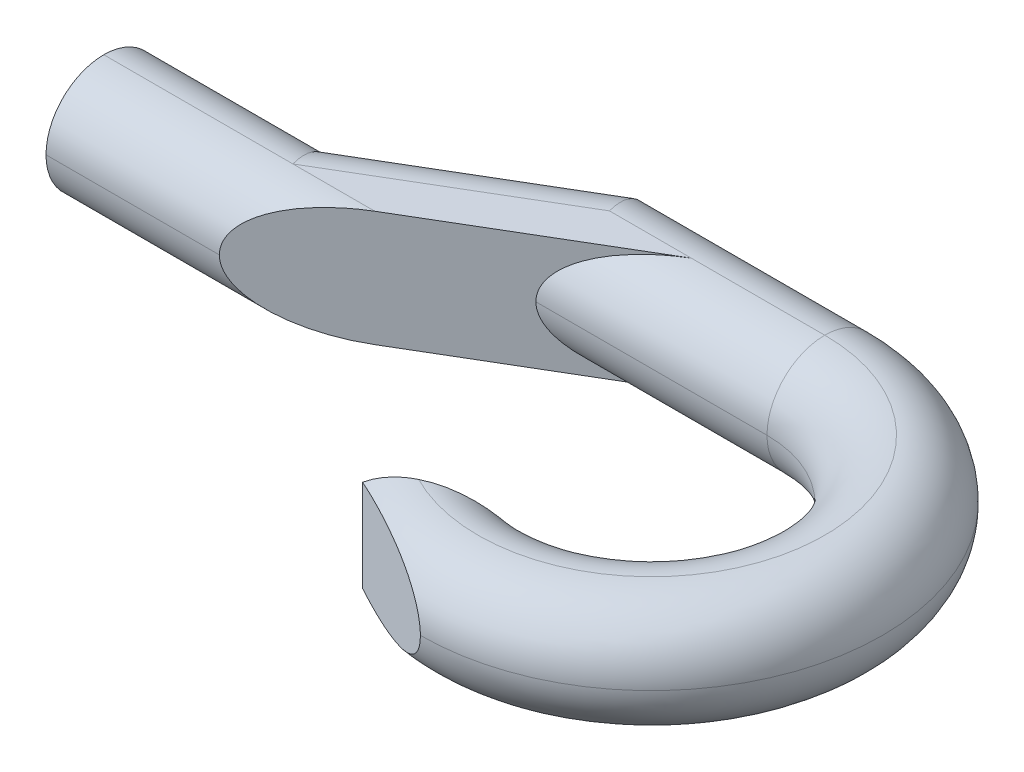
ISO-10303-21;
HEADER;
FILE_DESCRIPTION(('STEP AP214'),'2;1');
FILE_NAME('part.step','',(''),(''),'','','');
FILE_SCHEMA(('AUTOMOTIVE_DESIGN { 1 0 10303 214 1 1 1 1 }'));
ENDSEC;
DATA;
#1=APPLICATION_CONTEXT('core data for automotive mechanical design processes');
#2=APPLICATION_PROTOCOL_DEFINITION('international standard','automotive_design',2000,#1);
#3=PRODUCT_CONTEXT('',#1,'mechanical');
#4=PRODUCT('Part','Part','',(#3));
#5=PRODUCT_RELATED_PRODUCT_CATEGORY('part','',(#4));
#6=PRODUCT_DEFINITION_FORMATION('','',#4);
#7=PRODUCT_DEFINITION_CONTEXT('part definition',#1,'design');
#8=PRODUCT_DEFINITION('design','',#6,#7);
#9=PRODUCT_DEFINITION_SHAPE('','',#8);
#10=(LENGTH_UNIT() NAMED_UNIT(*) SI_UNIT(.MILLI.,.METRE.));
#11=(NAMED_UNIT(*) PLANE_ANGLE_UNIT() SI_UNIT($,.RADIAN.));
#12=(NAMED_UNIT(*) SI_UNIT($,.STERADIAN.) SOLID_ANGLE_UNIT());
#13=UNCERTAINTY_MEASURE_WITH_UNIT(LENGTH_MEASURE(1.E-05),#10,'distance_accuracy_value','');
#14=(GEOMETRIC_REPRESENTATION_CONTEXT(3) GLOBAL_UNCERTAINTY_ASSIGNED_CONTEXT((#13)) GLOBAL_UNIT_ASSIGNED_CONTEXT((#10,
#11,#12)) REPRESENTATION_CONTEXT('',''));
#15=CARTESIAN_POINT('',(0.,0.,0.));
#16=DIRECTION('',(0.,0.,1.));
#17=DIRECTION('',(1.,0.,0.));
#18=AXIS2_PLACEMENT_3D('',#15,#16,#17);
#19=CARTESIAN_POINT('',(0.,10.,0.));
#20=DIRECTION('',(-0.509011926202966,0.,-0.860759466391829));
#21=DIRECTION('',(-0.860759466391829,0.,0.509011926202966));
#22=AXIS2_PLACEMENT_3D('',#19,#20,#21);
#23=PLANE('',#22);
#24=DIRECTION('',(0.860759466391829,0.,-0.509011926202966));
#25=VECTOR('',#24,1.);
#26=CARTESIAN_POINT('',(0.,10.,0.));
#27=LINE('',#26,#25);
#28=CARTESIAN_POINT('',(-8.75998992992891,10.,5.18023852405933));
#29=VERTEX_POINT('',#28);
#30=CARTESIAN_POINT('',(8.45519939790767,10.,-5.));
#31=VERTEX_POINT('',#30);
#32=EDGE_CURVE('E330',#29,#31,#27,.T.);
#33=ORIENTED_EDGE('',*,*,#32,.F.);
#34=CARTESIAN_POINT('',(-8.75998992992891,5.,5.18023852405933));
#35=DIRECTION('',(-0.509011926202966,0.,-0.860759466391829));
#36=DIRECTION('',(0.860759466391829,0.,-0.509011926202966));
#37=AXIS2_PLACEMENT_3D('',#34,#35,#36);
#38=ELLIPSE('',#37,9.82295255299435,5.);
#39=CARTESIAN_POINT('',(-17.2151893278366,5.,10.1802385240593));
#40=VERTEX_POINT('',#39);
#41=EDGE_CURVE('E276',#29,#40,#38,.F.);
#42=ORIENTED_EDGE('',*,*,#41,.T.);
#43=CARTESIAN_POINT('',(-8.75998992992891,5.,5.18023852405933));
#44=DIRECTION('',(-0.509011926202966,0.,-0.860759466391829));
#45=DIRECTION('',(-0.860759466391829,0.,0.509011926202966));
#46=AXIS2_PLACEMENT_3D('',#43,#44,#45);
#47=ELLIPSE('',#46,9.82295255299435,5.);
#48=CARTESIAN_POINT('',(-8.75998992992891,0.,5.18023852405933));
#49=VERTEX_POINT('',#48);
#50=EDGE_CURVE('E279',#40,#49,#47,.F.);
#51=ORIENTED_EDGE('',*,*,#50,.T.);
#52=DIRECTION('',(0.860759466391829,0.,-0.509011926202966));
#53=VECTOR('',#52,1.);
#54=CARTESIAN_POINT('',(0.,0.,0.));
#55=LINE('',#54,#53);
#56=CARTESIAN_POINT('',(8.45519939790767,0.,-5.));
#57=VERTEX_POINT('',#56);
#58=EDGE_CURVE('E127',#49,#57,#55,.T.);
#59=ORIENTED_EDGE('',*,*,#58,.T.);
#60=CARTESIAN_POINT('',(8.45519939790767,5.,-5.));
#61=DIRECTION('',(-0.509011926202966,0.,-0.860759466391829));
#62=DIRECTION('',(-0.860759466391829,0.,0.509011926202966));
#63=AXIS2_PLACEMENT_3D('',#60,#61,#62);
#64=ELLIPSE('',#63,9.82295255299435,5.);
#65=CARTESIAN_POINT('',(0.,5.,0.));
#66=VERTEX_POINT('',#65);
#67=EDGE_CURVE('E255',#57,#66,#64,.T.);
#68=ORIENTED_EDGE('',*,*,#67,.T.);
#69=CARTESIAN_POINT('',(8.45519939790767,5.,-5.));
#70=DIRECTION('',(-0.509011926202966,0.,-0.860759466391829));
#71=DIRECTION('',(0.860759466391829,0.,-0.509011926202966));
#72=AXIS2_PLACEMENT_3D('',#69,#70,#71);
#73=ELLIPSE('',#72,9.82295255299435,5.);
#74=EDGE_CURVE('E270',#66,#31,#73,.T.);
#75=ORIENTED_EDGE('',*,*,#74,.T.);
#76=EDGE_LOOP('',(#33,#42,#51,#59,#68,#75));
#77=FACE_BOUND('',#76,.T.);
#78=ADVANCED_FACE('F34',(#77),#23,.F.);
#79=CARTESIAN_POINT('',(10.,10.,25.));
#80=DIRECTION('',(0.447213595499959,0.,0.894427190999916));
#81=DIRECTION('',(0.894427190999916,0.,-0.447213595499959));
#82=AXIS2_PLACEMENT_3D('',#79,#80,#81);
#83=PLANE('',#82);
#84=DIRECTION('',(0.,-1.,0.));
#85=VECTOR('',#84,1.);
#86=CARTESIAN_POINT('',(10.,10.,25.));
#87=LINE('',#86,#85);
#88=CARTESIAN_POINT('',(10.,8.97903145496468,25.));
#89=VERTEX_POINT('',#88);
#90=CARTESIAN_POINT('',(10.,1.02096854503532,25.));
#91=VERTEX_POINT('',#90);
#92=EDGE_CURVE('E189',#89,#91,#87,.T.);
#93=ORIENTED_EDGE('',*,*,#92,.F.);
#94=CARTESIAN_POINT('',(10.,8.97903145496468,25.));
#95=CARTESIAN_POINT('',(10.1314438396655,9.07614599086489,24.9342780801672));
#96=CARTESIAN_POINT('',(10.2669743519538,9.16620637315305,24.8665128240231));
#97=CARTESIAN_POINT('',(10.5446756551384,9.33213816624486,24.7276621724308));
#98=CARTESIAN_POINT('',(10.6868406381703,9.40802170680212,24.6565796809148));
#99=CARTESIAN_POINT('',(10.9732750556043,9.54414936479432,24.5133624721979));
#100=CARTESIAN_POINT('',(11.1174266422655,9.60470482611481,24.4412866788673));
#101=CARTESIAN_POINT('',(11.4096210452549,9.71253640143507,24.2951894773726));
#102=CARTESIAN_POINT('',(11.557664153243,9.75981151698451,24.2211679233785));
#103=CARTESIAN_POINT('',(11.9535861152284,9.86783688979917,24.0232069423858));
#104=CARTESIAN_POINT('',(12.2039710077293,9.91745575796615,23.8980144961353));
#105=CARTESIAN_POINT('',(12.5843441188074,9.96710390878704,23.7078279405963));
#106=CARTESIAN_POINT('',(12.7131902022344,9.97951874402064,23.6434048988828));
#107=CARTESIAN_POINT('',(12.9712381026715,9.99596154178999,23.5143809486643));
#108=CARTESIAN_POINT('',(13.1004396713526,9.9999943423065,23.4497801643237));
#109=CARTESIAN_POINT('',(13.229670385731,10.,23.3851648071345));
#110=B_SPLINE_CURVE_WITH_KNOTS('',3,(#94,#95,#96,#97,#98,#99,#100,#101,#102,#103,#104,#105,#106,
#107,#108,#109),.UNSPECIFIED.,.F.,.F.,(4,2,2,2,2,2,2,4),(0.,0.528131920993864,1.05580988009316,
1.57170680215591,2.0876425002934,2.9380369621023,3.37160826661759,3.80492925091076),.UNSPECIFIED.);
#111=CARTESIAN_POINT('',(13.229670385731,10.,23.3851648071345));
#112=VERTEX_POINT('',#111);
#113=EDGE_CURVE('E136',#89,#112,#110,.T.);
#114=ORIENTED_EDGE('',*,*,#113,.T.);
#115=CARTESIAN_POINT('',(13.229670385731,10.,23.3851648071345));
#116=CARTESIAN_POINT('',(13.4192563852724,9.9999874132156,23.2903718073638));
#117=CARTESIAN_POINT('',(13.6086996385396,9.99131417253069,23.1956501807302));
#118=CARTESIAN_POINT('',(13.9862774951186,9.95761326675993,23.0068612524407));
#119=CARTESIAN_POINT('',(14.1744130183487,9.93259859713784,22.9127934908257));
#120=CARTESIAN_POINT('',(14.7348645587275,9.83462832780576,22.6325677206363));
#121=CARTESIAN_POINT('',(15.1041585449585,9.73873687115786,22.4479207275208));
#122=CARTESIAN_POINT('',(15.6717311142593,9.54601317846157,22.1641344428704));
#123=CARTESIAN_POINT('',(15.8752201519589,9.4673406705736,22.0623899240206));
#124=CARTESIAN_POINT('',(16.2765097615109,9.29357585474262,21.8617451192445));
#125=CARTESIAN_POINT('',(16.4743117134408,9.19848757030224,21.7628441432796));
#126=CARTESIAN_POINT('',(16.8635463993545,8.99259816803629,21.5682268003227));
#127=CARTESIAN_POINT('',(17.0549705758971,8.88177691194088,21.4725147120514));
#128=CARTESIAN_POINT('',(17.4301511212549,8.64501474345501,21.2849244393726));
#129=CARTESIAN_POINT('',(17.6139096575384,8.51907814453133,21.1930451712308));
#130=CARTESIAN_POINT('',(17.9132516797742,8.29611467801229,21.0433741601129));
#131=CARTESIAN_POINT('',(18.0313303551182,8.20325318441014,20.9843348224409));
#132=CARTESIAN_POINT('',(18.2628310257111,8.01055365311796,20.8685844871444));
#133=CARTESIAN_POINT('',(18.3762538271889,7.91071683146165,20.8118730864055));
#134=CARTESIAN_POINT('',(18.5975290154277,7.70381163099563,20.7012354922861));
#135=CARTESIAN_POINT('',(18.7053868068974,7.59675051089487,20.6473065965513));
#136=CARTESIAN_POINT('',(18.9143927129238,7.37478224912413,20.5428036435381));
#137=CARTESIAN_POINT('',(19.0155433425784,7.25987808167234,20.4922283287108));
#138=CARTESIAN_POINT('',(19.2347191638469,6.99024872681707,20.3826404180765));
#139=CARTESIAN_POINT('',(19.3502593331098,6.83295696726374,20.3248703334451));
#140=CARTESIAN_POINT('',(19.5619217470014,6.50258237434365,20.2190391264993));
#141=CARTESIAN_POINT('',(19.6580709782211,6.32952198053633,20.1709645108894));
#142=CARTESIAN_POINT('',(19.7975682401305,6.01872983814376,20.1012158799347));
#143=CARTESIAN_POINT('',(19.8481503462006,5.88511767425433,20.0759248268997));
#144=CARTESIAN_POINT('',(19.9293116483345,5.61065935717491,20.0353441758327));
#145=CARTESIAN_POINT('',(19.9599632530537,5.4698414181651,20.0200183734731));
#146=CARTESIAN_POINT('',(19.9856864990253,5.27307515954598,20.0071567504874));
#147=CARTESIAN_POINT('',(19.9910339577537,5.21868524118308,20.0044830211231));
#148=CARTESIAN_POINT('',(19.9981957887106,5.10953951098989,20.0009021056447));
#149=CARTESIAN_POINT('',(20.0000051899633,5.05478329266055,19.9999974050183));
#150=CARTESIAN_POINT('',(20.,5.,20.));
#151=B_SPLINE_CURVE_WITH_KNOTS('',3,(#115,#116,#117,#118,#119,#120,#121,#122,#123,#124,#125,
#126,#127,#128,#129,#130,#131,#132,#133,#134,#135,#136,#137,#138,#139,#140,#141,#142,#143,#144,
#145,#146,#147,#148,#149,#150),.UNSPECIFIED.,.F.,.F.,(4,2,2,2,2,2,2,2,2,2,2,2,2,2,2,2,2,4),(0.,
0.635437473470802,1.27037023167414,2.53713701981072,3.25881661146123,3.98031957010776,
4.70275452475914,5.42498380607441,5.90899618345029,6.39292439076517,6.87637340380685,
7.3596400924358,7.96902325642079,8.57755239180175,9.01139474726357,9.44365198904135,
9.60768283097407,9.77194397134858),.UNSPECIFIED.);
#152=CARTESIAN_POINT('',(20.,5.,20.));
#153=VERTEX_POINT('',#152);
#154=EDGE_CURVE('E118',#112,#153,#151,.T.);
#155=ORIENTED_EDGE('',*,*,#154,.T.);
#156=CARTESIAN_POINT('',(20.,5.,20.));
#157=CARTESIAN_POINT('',(20.0000439205309,4.92725282215048,19.9999780397345));
#158=CARTESIAN_POINT('',(19.9968261885751,4.85453530196578,20.0015869057125));
#159=CARTESIAN_POINT('',(19.9842112124369,4.70990085737239,20.0078943937816));
#160=CARTESIAN_POINT('',(19.9748251216294,4.63798272577121,20.0125874391853));
#161=CARTESIAN_POINT('',(19.9504045673756,4.49651991326119,20.0247977163122));
#162=CARTESIAN_POINT('',(19.9354593654064,4.4269557359731,20.0322703172968));
#163=CARTESIAN_POINT('',(19.9004341573766,4.28944317042663,20.0497829213117));
#164=CARTESIAN_POINT('',(19.8803515454654,4.22149562134528,20.0598242272673));
#165=CARTESIAN_POINT('',(19.8275381122595,4.06325621405904,20.0862309438702));
#166=CARTESIAN_POINT('',(19.7928600479341,3.97377561311698,20.1035699760329));
#167=CARTESIAN_POINT('',(19.7165085134984,3.79865472928668,20.1417457432508));
#168=CARTESIAN_POINT('',(19.6748323358537,3.713015949092,20.1625838320731));
#169=CARTESIAN_POINT('',(19.5406306226454,3.46066118026153,20.2296846886773));
#170=CARTESIAN_POINT('',(19.43937564948,3.29973280386885,20.28031217526));
#171=CARTESIAN_POINT('',(19.2295408933711,3.00355830545036,20.3852295533145));
#172=CARTESIAN_POINT('',(19.1220732376573,2.86729171734751,20.4389633811714));
#173=CARTESIAN_POINT('',(18.8972127602712,2.60525156607407,20.5513936198644));
#174=CARTESIAN_POINT('',(18.7798117034918,2.47948688436479,20.6100941482541));
#175=CARTESIAN_POINT('',(18.5372550105338,2.23747257553187,20.7313724947331));
#176=CARTESIAN_POINT('',(18.4120915565041,2.12123282404359,20.7939542217479));
#177=CARTESIAN_POINT('',(18.1554797240984,1.89774332979946,20.9222601379508));
#178=CARTESIAN_POINT('',(18.0240296104887,1.79049609189585,20.9879851947556));
#179=CARTESIAN_POINT('',(17.6844968691111,1.52995260930174,21.1577515654444));
#180=CARTESIAN_POINT('',(17.4728194846964,1.38247975475447,21.2635902576518));
#181=CARTESIAN_POINT('',(17.0391511045579,1.10770638384676,21.4804244477211));
#182=CARTESIAN_POINT('',(16.8171548830728,0.980416235755965,21.5914225584636));
#183=CARTESIAN_POINT('',(16.3650570183997,0.747178337491017,21.8174714908001));
#184=CARTESIAN_POINT('',(16.1349786997275,0.641174287225436,21.9325106501362));
#185=CARTESIAN_POINT('',(15.6675910820753,0.451469522334892,22.1662044589623));
#186=CARTESIAN_POINT('',(15.4302812971111,0.367770310386471,22.2848593514444));
#187=CARTESIAN_POINT('',(14.870831347886,0.200916672026909,22.564584326057));
#188=CARTESIAN_POINT('',(14.546408340746,0.126954071020458,22.726795829627));
#189=CARTESIAN_POINT('',(14.0553360034705,0.0516125931084803,22.9723319982648));
#190=CARTESIAN_POINT('',(13.890755820862,0.0324313229934739,23.054622089569));
#191=CARTESIAN_POINT('',(13.560703175855,0.00662411355169991,23.2196484120725));
#192=CARTESIAN_POINT('',(13.3952301821002,6.73404712988565E-06,23.3023849089499));
#193=CARTESIAN_POINT('',(13.229670385731,0.,23.3851648071345));
#194=B_SPLINE_CURVE_WITH_KNOTS('',3,(#156,#157,#158,#159,#160,#161,#162,#163,#164,#165,#166,
#167,#168,#169,#170,#171,#172,#173,#174,#175,#176,#177,#178,#179,#180,#181,#182,#183,#184,#185,
#186,#187,#188,#189,#190,#191,#192,#193),.UNSPECIFIED.,.F.,.F.,(4,2,2,2,2,2,2,2,2,2,2,2,2,2,2,2,
2,2,4),(0.,0.218105244773615,0.435817201607098,0.650174541403505,0.864640826104793,
1.15671017290262,1.44889278130492,2.03717949471163,2.58152244632342,3.12632118232809,
3.67167781150728,4.21718584784023,5.05264684738999,5.88853565942876,6.72218361322469,
7.55588771567754,8.66317362461275,9.21781343072216,9.77283097944401),.UNSPECIFIED.);
#195=CARTESIAN_POINT('',(13.229670385731,0.,23.3851648071345));
#196=VERTEX_POINT('',#195);
#197=EDGE_CURVE('E195',#153,#196,#194,.T.);
#198=ORIENTED_EDGE('',*,*,#197,.T.);
#199=CARTESIAN_POINT('',(13.229670385731,0.,23.3851648071345));
#200=CARTESIAN_POINT('',(13.0367481688262,-1.80123719044556E-05,23.4816259155869));
#201=CARTESIAN_POINT('',(12.8437293967664,0.00899637278797433,23.5781353016168));
#202=CARTESIAN_POINT('',(12.4588019108266,0.0460544146975102,23.7705990445867));
#203=CARTESIAN_POINT('',(12.2668960182035,0.074134352529127,23.8665519908982));
#204=CARTESIAN_POINT('',(11.8917541756371,0.149193242742677,24.0541229121814));
#205=CARTESIAN_POINT('',(11.708428038556,0.195601779702971,24.145785980722));
#206=CARTESIAN_POINT('',(11.3467927063992,0.307890148633818,24.3266036468004));
#207=CARTESIAN_POINT('',(11.1684783224901,0.373748963674398,24.4157608387549));
#208=CARTESIAN_POINT('',(10.8209132909679,0.524481870568148,24.5895433545161));
#209=CARTESIAN_POINT('',(10.6515771859414,0.609107880819837,24.6742114070293));
#210=CARTESIAN_POINT('',(10.3194755027803,0.799260620275825,24.8402622486099));
#211=CARTESIAN_POINT('',(10.1568410994312,0.905073097805667,24.9215794502844));
#212=CARTESIAN_POINT('',(10.,1.02096854503532,25.));
#213=B_SPLINE_CURVE_WITH_KNOTS('',3,(#199,#200,#201,#202,#203,#204,#205,#206,#207,#208,#209,
#210,#211,#212),.UNSPECIFIED.,.F.,.F.,(4,2,2,2,2,2,4),(0.,0.647055998921626,1.29534678672356,
1.92487729216951,2.55373003403595,3.17471906698392,3.80472861914894),.UNSPECIFIED.);
#214=EDGE_CURVE('E140',#196,#91,#213,.T.);
#215=ORIENTED_EDGE('',*,*,#214,.T.);
#216=EDGE_LOOP('',(#93,#114,#155,#198,#215));
#217=FACE_BOUND('',#216,.T.);
#218=ADVANCED_FACE('F212',(#217),#83,.F.);
#219=CARTESIAN_POINT('',(10.,10.,25.));
#220=DIRECTION('',(0.447213595499957,0.,-0.894427190999916));
#221=DIRECTION('',(-0.894427190999916,0.,-0.447213595499958));
#222=AXIS2_PLACEMENT_3D('',#219,#220,#221);
#223=PLANE('',#222);
#224=CARTESIAN_POINT('',(10.,1.02096854503532,25.));
#225=CARTESIAN_POINT('',(10.1177949058358,1.00854229991839,25.0588974529179));
#226=CARTESIAN_POINT('',(10.2356889058521,0.997337852807222,25.117844452926));
#227=CARTESIAN_POINT('',(10.4716320760156,0.977264478508837,25.2358160380078));
#228=CARTESIAN_POINT('',(10.5896812406821,0.968395470944728,25.294840620341));
#229=CARTESIAN_POINT('',(10.943995487274,0.945129249382972,25.471997743637));
#230=CARTESIAN_POINT('',(11.180440941044,0.934071425841117,25.590220470522));
#231=CARTESIAN_POINT('',(11.6543818940752,0.920331156096913,25.8271909470376));
#232=CARTESIAN_POINT('',(11.8918780754123,0.917679434162477,25.9459390377061));
#233=CARTESIAN_POINT('',(12.366832799373,0.920718540092157,26.1834163996865));
#234=CARTESIAN_POINT('',(12.6042913415006,0.926409470027935,26.3021456707503));
#235=CARTESIAN_POINT('',(13.0793656817564,0.946411431608165,26.5396828408782));
#236=CARTESIAN_POINT('',(13.3169809456055,0.960738539142545,26.6584904728027));
#237=CARTESIAN_POINT('',(13.7916155294724,0.998677572341629,26.8958077647362));
#238=CARTESIAN_POINT('',(14.0286348801323,1.02228901034978,27.0143174400662));
#239=CARTESIAN_POINT('',(14.5013437290743,1.07982502071214,27.2506718645371));
#240=CARTESIAN_POINT('',(14.7370346308456,1.11373501063547,27.3685173154228));
#241=CARTESIAN_POINT('',(15.2067857263582,1.19338904925115,27.6033928631791));
#242=CARTESIAN_POINT('',(15.4408463442368,1.23912989217055,27.7204231721184));
#243=CARTESIAN_POINT('',(15.8090221962134,1.32245269685463,27.9045110981067));
#244=CARTESIAN_POINT('',(15.9439736371362,1.35543892769562,27.9719868185681));
#245=CARTESIAN_POINT('',(16.2127802409621,1.42661687862297,28.1063901204811));
#246=CARTESIAN_POINT('',(16.3466354192205,1.46480852566539,28.1733177096103));
#247=CARTESIAN_POINT('',(16.6133876105694,1.54711428470312,28.3066938052847));
#248=CARTESIAN_POINT('',(16.7462797224503,1.59124838162806,28.3731398612251));
#249=CARTESIAN_POINT('',(17.0102117940501,1.68601443225911,28.5051058970251));
#250=CARTESIAN_POINT('',(17.1412516615391,1.73664670827638,28.5706258307696));
#251=CARTESIAN_POINT('',(17.4327012017959,1.85846608401295,28.716350600898));
#252=CARTESIAN_POINT('',(17.5924522122514,1.93165130215949,28.7962261061257));
#253=CARTESIAN_POINT('',(17.9068198186196,2.09106985905097,28.9534099093098));
#254=CARTESIAN_POINT('',(18.0614336684832,2.17731004366637,29.0307168342416));
#255=CARTESIAN_POINT('',(18.3624534214239,2.36432364050762,29.181226710712));
#256=CARTESIAN_POINT('',(18.5088994334227,2.46501536092395,29.2544497167114));
#257=CARTESIAN_POINT('',(18.7911795665974,2.68333605011158,29.3955897832987));
#258=CARTESIAN_POINT('',(18.9270298931865,2.80093833940751,29.4635149465933));
#259=CARTESIAN_POINT('',(19.1633276568847,3.03506461842296,29.5816638284424));
#260=CARTESIAN_POINT('',(19.2659701987201,3.14878917989229,29.6329850993601));
#261=CARTESIAN_POINT('',(19.4569147631424,3.39069684688849,29.7284573815712));
#262=CARTESIAN_POINT('',(19.545209537692,3.51888720501546,29.772604768846));
#263=CARTESIAN_POINT('',(19.7034677372342,3.79132467322168,29.8517338686171));
#264=CARTESIAN_POINT('',(19.7731994428721,3.93574538800656,29.8865997214361));
#265=CARTESIAN_POINT('',(19.8584929226604,4.16117024585111,29.9292464613302));
#266=CARTESIAN_POINT('',(19.8836926997172,4.2377046082494,29.9418463498586));
#267=CARTESIAN_POINT('',(19.9270812841343,4.39320063339911,29.9635406420671));
#268=CARTESIAN_POINT('',(19.9452746662347,4.47216067583643,29.9726373331174));
#269=CARTESIAN_POINT('',(19.9729941498478,4.62561039057173,29.9864970749239));
#270=CARTESIAN_POINT('',(19.9830818460984,4.69997338394329,29.9915409230492));
#271=CARTESIAN_POINT('',(19.9966045175073,4.84954882727625,29.9983022587537));
#272=CARTESIAN_POINT('',(20.0000305993329,4.92476227814308,30.0000152996665));
#273=CARTESIAN_POINT('',(20.,5.,30.));
#274=B_SPLINE_CURVE_WITH_KNOTS('',3,(#224,#225,#226,#227,#228,#229,#230,#231,#232,#233,#234,
#235,#236,#237,#238,#239,#240,#241,#242,#243,#244,#245,#246,#247,#248,#249,#250,#251,#252,#253,
#254,#255,#256,#257,#258,#259,#260,#261,#262,#263,#264,#265,#266,#267,#268,#269,#270,#271,#272,
#273),.UNSPECIFIED.,.F.,.F.,(4,2,2,2,2,2,2,2,2,2,2,2,2,2,2,2,2,2,2,2,2,2,2,2,4),(0.,
0.396837470232095,0.793661281051945,1.58726305133202,2.38376210838724,3.18027091062431,
3.97826697976279,4.77622114000533,5.57305064848105,6.36966446809224,6.83292003550503,
7.29616910304899,7.76101695304317,8.22588786851401,8.80449981294826,9.38341623250696,
9.95918039476376,10.5340459535979,11.0175431225485,11.5012837846958,11.9908063549373,
12.2351278702068,12.479289587152,12.7045640603554,12.9301390716639),.UNSPECIFIED.);
#275=CARTESIAN_POINT('',(20.,5.,30.));
#276=VERTEX_POINT('',#275);
#277=EDGE_CURVE('E246',#91,#276,#274,.T.);
#278=ORIENTED_EDGE('',*,*,#277,.T.);
#279=CARTESIAN_POINT('',(20.,5.,30.));
#280=CARTESIAN_POINT('',(20.0000199388866,5.06689131946843,30.0000099694433));
#281=CARTESIAN_POINT('',(19.9973160101324,5.13377078003633,29.9986580050662));
#282=CARTESIAN_POINT('',(19.9866133473398,5.2669503036613,29.9933066736699));
#283=CARTESIAN_POINT('',(19.9786185005331,5.33325075590885,29.9893092502666));
#284=CARTESIAN_POINT('',(19.9575721908441,5.46428287859338,29.978786095422));
#285=CARTESIAN_POINT('',(19.9445622530312,5.52902291018646,29.9722811265156));
#286=CARTESIAN_POINT('',(19.9137587009353,5.65705493298768,29.9568793504676));
#287=CARTESIAN_POINT('',(19.8959644178448,5.72034672040134,29.9479822089224));
#288=CARTESIAN_POINT('',(19.8359898936199,5.90713947009579,29.9179949468099));
#289=CARTESIAN_POINT('',(19.7871391215413,6.02802717005694,29.8935695607707));
#290=CARTESIAN_POINT('',(19.674588933385,6.26092748116314,29.8372944666925));
#291=CARTESIAN_POINT('',(19.6108569888109,6.37291991906521,29.8054284944054));
#292=CARTESIAN_POINT('',(19.4292994151863,6.65216127222375,29.7146497075932));
#293=CARTESIAN_POINT('',(19.3020915802587,6.81178916317241,29.6510457901293));
#294=CARTESIAN_POINT('',(19.027052703363,7.10693129469851,29.5135263516815));
#295=CARTESIAN_POINT('',(18.8791721764434,7.2423858450825,29.4395860882217));
#296=CARTESIAN_POINT('',(18.5943270616383,7.47194844377772,29.2971635308192));
#297=CARTESIAN_POINT('',(18.4593534563055,7.56920671723275,29.2296767281528));
#298=CARTESIAN_POINT('',(18.1823425671469,7.7503508319413,29.0911712835735));
#299=CARTESIAN_POINT('',(18.0403001607056,7.83422678457666,29.0201500803528));
#300=CARTESIAN_POINT('',(17.7509374252701,7.99033752213625,28.875468712635));
#301=CARTESIAN_POINT('',(17.6036083395527,8.06255178953923,28.8018041697764));
#302=CARTESIAN_POINT('',(17.3052110064551,8.19667874886895,28.6526055032275));
#303=CARTESIAN_POINT('',(17.1541412877594,8.25858731083304,28.5770706438797));
#304=CARTESIAN_POINT('',(16.8422165897048,8.3760170826753,28.4211082948524));
#305=CARTESIAN_POINT('',(16.6812330405868,8.43110800542437,28.3406165202934));
#306=CARTESIAN_POINT('',(16.3571312659577,8.53261442579266,28.1785656329789));
#307=CARTESIAN_POINT('',(16.1940132649419,8.5790308280484,28.0970066324709));
#308=CARTESIAN_POINT('',(15.8660343797672,8.66428479838027,27.9330171898836));
#309=CARTESIAN_POINT('',(15.7011718671883,8.70311447661552,27.8505859335941));
#310=CARTESIAN_POINT('',(15.3702789317104,8.77400316781053,27.6851394658552));
#311=CARTESIAN_POINT('',(15.2042483678105,8.80606134834005,27.6021241839053));
#312=CARTESIAN_POINT('',(14.7039934517179,8.89334988027661,27.351996725859));
#313=CARTESIAN_POINT('',(14.3684866326661,8.93947442375288,27.1842433163331));
#314=CARTESIAN_POINT('',(13.6959937460891,9.01172235961616,26.8479968730445));
#315=CARTESIAN_POINT('',(13.3590084244861,9.03785488105632,26.679504212243));
#316=CARTESIAN_POINT('',(12.7686294770841,9.06818241201123,26.384314738542));
#317=CARTESIAN_POINT('',(12.5153865606539,9.07622716242597,26.2576932803269));
#318=CARTESIAN_POINT('',(12.0088084192186,9.08280320567998,26.0044042096093));
#319=CARTESIAN_POINT('',(11.7554731968072,9.08133474788297,25.8777365984036));
#320=CARTESIAN_POINT('',(11.2514596493294,9.06887731849851,25.6257298246647));
#321=CARTESIAN_POINT('',(11.000779563126,9.05798156561461,25.500389781563));
#322=CARTESIAN_POINT('',(10.6251410201666,9.03416891052277,25.3125705100833));
#323=CARTESIAN_POINT('',(10.499987578042,9.02498608783543,25.249993789021));
#324=CARTESIAN_POINT('',(10.2498524296359,9.00400335721351,25.124926214818));
#325=CARTESIAN_POINT('',(10.1248707293113,8.99220336069759,25.0624353646557));
#326=CARTESIAN_POINT('',(10.,8.97903145496468,25.));
#327=B_SPLINE_CURVE_WITH_KNOTS('',3,(#279,#280,#281,#282,#283,#284,#285,#286,#287,#288,#289,
#290,#291,#292,#293,#294,#295,#296,#297,#298,#299,#300,#301,#302,#303,#304,#305,#306,#307,#308,
#309,#310,#311,#312,#313,#314,#315,#316,#317,#318,#319,#320,#321,#322,#323,#324,#325,#326),
.UNSPECIFIED.,.F.,.F.,(4,2,2,2,2,2,2,2,2,2,2,2,2,2,2,2,2,2,2,2,2,2,2,4),(0.,0.200586365014153,
0.401025522808957,0.599839502605497,0.798681289228806,1.19494919083708,1.59209153340491,
2.22979745364935,2.8690568791606,3.40688590847676,3.94511053418031,4.48427202915212,
5.0236490730853,5.58808109412894,6.15245421957228,6.71741117890548,7.28243754886503,
8.4155108434532,9.54806642799285,10.3976559609469,11.247223224239,12.0884846001808,
12.5091435132906,12.9298166662689),.UNSPECIFIED.);
#328=EDGE_CURVE('E230',#276,#89,#327,.T.);
#329=ORIENTED_EDGE('',*,*,#328,.T.);
#330=ORIENTED_EDGE('',*,*,#92,.T.);
#331=EDGE_LOOP('',(#278,#329,#330));
#332=FACE_BOUND('',#331,.T.);
#333=ADVANCED_FACE('F217',(#332),#223,.F.);
#334=CARTESIAN_POINT('',(-32.2151893278366,10.,0.180238524059332));
#335=DIRECTION('',(1.,0.,0.));
#336=DIRECTION('',(0.,0.,-1.));
#337=AXIS2_PLACEMENT_3D('',#334,#335,#336);
#338=PLANE('',#337);
#339=CARTESIAN_POINT('',(-32.2151893278366,5.,5.18023852405933));
#340=DIRECTION('',(-1.,0.,0.));
#341=DIRECTION('',(0.,0.,1.));
#342=AXIS2_PLACEMENT_3D('',#339,#340,#341);
#343=CIRCLE('',#342,2.8);
#344=CARTESIAN_POINT('',(-32.2151893278366,5.,7.98023852405933));
#345=VERTEX_POINT('',#344);
#346=EDGE_CURVE('E333',#345,#345,#343,.T.);
#347=ORIENTED_EDGE('',*,*,#346,.F.);
#348=EDGE_LOOP('',(#347));
#349=FACE_BOUND('',#348,.T.);
#350=CARTESIAN_POINT('',(-32.2151893278366,5.,5.18023852405933));
#351=DIRECTION('',(1.,0.,0.));
#352=DIRECTION('',(0.,0.,-1.));
#353=AXIS2_PLACEMENT_3D('',#350,#351,#352);
#354=CIRCLE('',#353,5.);
#355=CARTESIAN_POINT('',(-32.2151893278366,5.,10.1802385240593));
#356=VERTEX_POINT('',#355);
#357=CARTESIAN_POINT('',(-32.2151893278366,10.,5.18023852405933));
#358=VERTEX_POINT('',#357);
#359=EDGE_CURVE('E273',#356,#358,#354,.F.);
#360=ORIENTED_EDGE('',*,*,#359,.T.);
#361=CARTESIAN_POINT('',(-32.2151893278366,5.,5.18023852405933));
#362=DIRECTION('',(1.,0.,0.));
#363=DIRECTION('',(0.,0.,-1.));
#364=AXIS2_PLACEMENT_3D('',#361,#362,#363);
#365=CIRCLE('',#364,5.);
#366=CARTESIAN_POINT('',(-32.2151893278366,5.,0.180238524059332));
#367=VERTEX_POINT('',#366);
#368=EDGE_CURVE('E11',#358,#367,#365,.F.);
#369=ORIENTED_EDGE('',*,*,#368,.T.);
#370=CARTESIAN_POINT('',(-32.2151893278366,5.,5.18023852405933));
#371=DIRECTION('',(1.,0.,0.));
#372=DIRECTION('',(0.,0.,-1.));
#373=AXIS2_PLACEMENT_3D('',#370,#371,#372);
#374=CIRCLE('',#373,5.);
#375=CARTESIAN_POINT('',(-32.2151893278366,0.,5.18023852405933));
#376=VERTEX_POINT('',#375);
#377=EDGE_CURVE('E44',#367,#376,#374,.F.);
#378=ORIENTED_EDGE('',*,*,#377,.T.);
#379=CARTESIAN_POINT('',(-32.2151893278366,5.,5.18023852405933));
#380=DIRECTION('',(1.,0.,0.));
#381=DIRECTION('',(0.,0.,-1.));
#382=AXIS2_PLACEMENT_3D('',#379,#380,#381);
#383=CIRCLE('',#382,5.);
#384=EDGE_CURVE('E117',#376,#356,#383,.F.);
#385=ORIENTED_EDGE('',*,*,#384,.T.);
#386=EDGE_LOOP('',(#360,#369,#378,#385));
#387=FACE_BOUND('',#386,.T.);
#388=ADVANCED_FACE('F348',(#349,#387),#338,.F.);
#389=CARTESIAN_POINT('',(20.,10.,10.));
#390=DIRECTION('',(0.,-1.,0.));
#391=DIRECTION('',(0.,0.,-1.));
#392=AXIS2_PLACEMENT_3D('',#389,#390,#391);
#393=PLANE('',#392);
#394=ORIENTED_EDGE('',*,*,#32,.T.);
#395=DIRECTION('',(-1.,0.,0.));
#396=VECTOR('',#395,1.);
#397=CARTESIAN_POINT('',(20.,10.,-5.));
#398=LINE('',#397,#396);
#399=CARTESIAN_POINT('',(1.36775315508668,10.,-5.));
#400=VERTEX_POINT('',#399);
#401=EDGE_CURVE('E252',#31,#400,#398,.T.);
#402=ORIENTED_EDGE('',*,*,#401,.T.);
#403=DIRECTION('',(-0.860759466391829,0.,0.509011926202966));
#404=VECTOR('',#403,1.);
#405=CARTESIAN_POINT('',(8.60046013096691,10.,-9.27707652741462));
#406=LINE('',#405,#404);
#407=CARTESIAN_POINT('',(-15.8474361727499,10.,5.18023852405933));
#408=VERTEX_POINT('',#407);
#409=EDGE_CURVE('E173',#400,#408,#406,.T.);
#410=ORIENTED_EDGE('',*,*,#409,.T.);
#411=DIRECTION('',(1.,0.,0.));
#412=VECTOR('',#411,1.);
#413=CARTESIAN_POINT('',(20.,10.,5.18023852405932));
#414=LINE('',#413,#412);
#415=EDGE_CURVE('E184',#408,#29,#414,.T.);
#416=ORIENTED_EDGE('',*,*,#415,.T.);
#417=EDGE_LOOP('',(#394,#402,#410,#416));
#418=FACE_BOUND('',#417,.T.);
#419=ADVANCED_FACE('F350',(#418),#393,.F.);
#420=CARTESIAN_POINT('',(20.,0.,10.));
#421=DIRECTION('',(0.,-1.,0.));
#422=DIRECTION('',(0.,0.,-1.));
#423=AXIS2_PLACEMENT_3D('',#420,#421,#422);
#424=PLANE('',#423);
#425=DIRECTION('',(-0.860759466391829,0.,0.509011926202966));
#426=VECTOR('',#425,1.);
#427=CARTESIAN_POINT('',(2.54505963101483,0.,-5.69620266804086));
#428=LINE('',#427,#426);
#429=CARTESIAN_POINT('',(-15.8474361727499,0.,5.18023852405933));
#430=VERTEX_POINT('',#429);
#431=CARTESIAN_POINT('',(1.36775315508668,0.,-5.));
#432=VERTEX_POINT('',#431);
#433=EDGE_CURVE('E125',#430,#432,#428,.F.);
#434=ORIENTED_EDGE('',*,*,#433,.T.);
#435=DIRECTION('',(-1.,0.,0.));
#436=VECTOR('',#435,1.);
#437=CARTESIAN_POINT('',(20.,0.,-5.));
#438=LINE('',#437,#436);
#439=EDGE_CURVE('E135',#432,#57,#438,.F.);
#440=ORIENTED_EDGE('',*,*,#439,.T.);
#441=ORIENTED_EDGE('',*,*,#58,.F.);
#442=DIRECTION('',(1.,0.,0.));
#443=VECTOR('',#442,1.);
#444=CARTESIAN_POINT('',(-32.2151893278366,0.,5.18023852405933));
#445=LINE('',#444,#443);
#446=EDGE_CURVE('E114',#49,#430,#445,.F.);
#447=ORIENTED_EDGE('',*,*,#446,.T.);
#448=EDGE_LOOP('',(#434,#440,#441,#447));
#449=FACE_BOUND('',#448,.T.);
#450=ADVANCED_FACE('F122',(#449),#424,.T.);
#451=CARTESIAN_POINT('',(20.,5.,-5.));
#452=DIRECTION('',(-1.,0.,0.));
#453=DIRECTION('',(0.,0.,1.));
#454=AXIS2_PLACEMENT_3D('',#451,#452,#453);
#455=CYLINDRICAL_SURFACE('',#454,5.);
#456=ORIENTED_EDGE('',*,*,#67,.F.);
#457=DIRECTION('',(1.,0.,0.));
#458=VECTOR('',#457,1.);
#459=CARTESIAN_POINT('',(0.,0.,-5.));
#460=LINE('',#459,#458);
#461=CARTESIAN_POINT('',(20.,0.,-5.));
#462=VERTEX_POINT('',#461);
#463=EDGE_CURVE('E128',#462,#57,#460,.F.);
#464=ORIENTED_EDGE('',*,*,#463,.F.);
#465=CARTESIAN_POINT('',(20.,5.,-5.));
#466=DIRECTION('',(1.,0.,0.));
#467=DIRECTION('',(0.,0.,-1.));
#468=AXIS2_PLACEMENT_3D('',#465,#466,#467);
#469=CIRCLE('',#468,5.);
#470=CARTESIAN_POINT('',(20.,5.,0.));
#471=VERTEX_POINT('',#470);
#472=EDGE_CURVE('E80',#471,#462,#469,.T.);
#473=ORIENTED_EDGE('',*,*,#472,.F.);
#474=DIRECTION('',(1.,0.,0.));
#475=VECTOR('',#474,1.);
#476=CARTESIAN_POINT('',(20.,5.,0.));
#477=LINE('',#476,#475);
#478=EDGE_CURVE('E261',#66,#471,#477,.T.);
#479=ORIENTED_EDGE('',*,*,#478,.F.);
#480=EDGE_LOOP('',(#456,#464,#473,#479));
#481=FACE_BOUND('',#480,.T.);
#482=ADVANCED_FACE('F293',(#481),#455,.T.);
#483=CARTESIAN_POINT('',(20.,5.,10.));
#484=DIRECTION('',(0.,-1.,0.));
#485=DIRECTION('',(0.,0.,-1.));
#486=AXIS2_PLACEMENT_3D('',#483,#484,#485);
#487=TOROIDAL_SURFACE('',#486,15.,5.);
#488=CARTESIAN_POINT('',(20.,0.,10.));
#489=DIRECTION('',(0.,-1.,0.));
#490=DIRECTION('',(0.,0.,-1.));
#491=AXIS2_PLACEMENT_3D('',#488,#489,#490);
#492=CIRCLE('',#491,15.);
#493=EDGE_CURVE('E282',#196,#462,#492,.F.);
#494=ORIENTED_EDGE('',*,*,#493,.F.);
#495=ORIENTED_EDGE('',*,*,#197,.F.);
#496=CARTESIAN_POINT('',(20.,5.,10.));
#497=DIRECTION('',(0.,-1.,0.));
#498=DIRECTION('',(0.,0.,-1.));
#499=AXIS2_PLACEMENT_3D('',#496,#497,#498);
#500=CIRCLE('',#499,10.);
#501=EDGE_CURVE('E263',#471,#153,#500,.T.);
#502=ORIENTED_EDGE('',*,*,#501,.F.);
#503=ORIENTED_EDGE('',*,*,#472,.T.);
#504=EDGE_LOOP('',(#494,#495,#502,#503));
#505=FACE_BOUND('',#504,.T.);
#506=ADVANCED_FACE('F208',(#505),#487,.T.);
#507=CARTESIAN_POINT('',(20.,5.,-5.));
#508=DIRECTION('',(1.,0.,0.));
#509=DIRECTION('',(0.,0.,-1.));
#510=AXIS2_PLACEMENT_3D('',#507,#508,#509);
#511=CYLINDRICAL_SURFACE('',#510,5.);
#512=ORIENTED_EDGE('',*,*,#74,.F.);
#513=ORIENTED_EDGE('',*,*,#478,.T.);
#514=CARTESIAN_POINT('',(20.,5.,-5.));
#515=DIRECTION('',(1.,0.,0.));
#516=DIRECTION('',(0.,0.,-1.));
#517=AXIS2_PLACEMENT_3D('',#514,#515,#516);
#518=CIRCLE('',#517,5.);
#519=CARTESIAN_POINT('',(20.,10.,-5.));
#520=VERTEX_POINT('',#519);
#521=EDGE_CURVE('E259',#520,#471,#518,.T.);
#522=ORIENTED_EDGE('',*,*,#521,.F.);
#523=DIRECTION('',(1.,0.,0.));
#524=VECTOR('',#523,1.);
#525=CARTESIAN_POINT('',(20.,10.,-5.));
#526=LINE('',#525,#524);
#527=EDGE_CURVE('E183',#31,#520,#526,.T.);
#528=ORIENTED_EDGE('',*,*,#527,.F.);
#529=EDGE_LOOP('',(#512,#513,#522,#528));
#530=FACE_BOUND('',#529,.T.);
#531=ADVANCED_FACE('F312',(#530),#511,.T.);
#532=CARTESIAN_POINT('',(20.,5.,10.));
#533=DIRECTION('',(0.,-1.,0.));
#534=DIRECTION('',(0.,0.,-1.));
#535=AXIS2_PLACEMENT_3D('',#532,#533,#534);
#536=TOROIDAL_SURFACE('',#535,15.,5.);
#537=ORIENTED_EDGE('',*,*,#521,.T.);
#538=ORIENTED_EDGE('',*,*,#501,.T.);
#539=ORIENTED_EDGE('',*,*,#154,.F.);
#540=CARTESIAN_POINT('',(20.,10.,10.));
#541=DIRECTION('',(0.,-1.,0.));
#542=DIRECTION('',(0.,0.,-1.));
#543=AXIS2_PLACEMENT_3D('',#540,#541,#542);
#544=CIRCLE('',#543,15.);
#545=EDGE_CURVE('E187',#520,#112,#544,.T.);
#546=ORIENTED_EDGE('',*,*,#545,.F.);
#547=EDGE_LOOP('',(#537,#538,#539,#546));
#548=FACE_BOUND('',#547,.T.);
#549=ADVANCED_FACE('F307',(#548),#536,.T.);
#550=CARTESIAN_POINT('',(-17.2151893278366,5.,5.18023852405933));
#551=DIRECTION('',(-1.,0.,0.));
#552=DIRECTION('',(0.,0.,1.));
#553=AXIS2_PLACEMENT_3D('',#550,#551,#552);
#554=CYLINDRICAL_SURFACE('',#553,5.);
#555=DIRECTION('',(1.,0.,0.));
#556=VECTOR('',#555,1.);
#557=CARTESIAN_POINT('',(-17.2151893278366,5.,10.1802385240593));
#558=LINE('',#557,#556);
#559=EDGE_CURVE('E256',#356,#40,#558,.T.);
#560=ORIENTED_EDGE('',*,*,#559,.F.);
#561=ORIENTED_EDGE('',*,*,#384,.F.);
#562=EDGE_CURVE('E108',#430,#376,#445,.F.);
#563=ORIENTED_EDGE('',*,*,#562,.F.);
#564=ORIENTED_EDGE('',*,*,#446,.F.);
#565=ORIENTED_EDGE('',*,*,#50,.F.);
#566=EDGE_LOOP('',(#560,#561,#563,#564,#565));
#567=FACE_BOUND('',#566,.T.);
#568=ADVANCED_FACE('F111',(#567),#554,.T.);
#569=CARTESIAN_POINT('',(20.,5.,5.18023852405932));
#570=DIRECTION('',(1.,0.,0.));
#571=DIRECTION('',(0.,0.,-1.));
#572=AXIS2_PLACEMENT_3D('',#569,#570,#571);
#573=CYLINDRICAL_SURFACE('',#572,5.);
#574=ORIENTED_EDGE('',*,*,#359,.F.);
#575=ORIENTED_EDGE('',*,*,#559,.T.);
#576=ORIENTED_EDGE('',*,*,#41,.F.);
#577=ORIENTED_EDGE('',*,*,#415,.F.);
#578=EDGE_CURVE('E178',#358,#408,#414,.T.);
#579=ORIENTED_EDGE('',*,*,#578,.F.);
#580=EDGE_LOOP('',(#574,#575,#576,#577,#579));
#581=FACE_BOUND('',#580,.T.);
#582=ADVANCED_FACE('F351',(#581),#573,.T.);
#583=CARTESIAN_POINT('',(-17.2151893278366,5.,5.18023852405933));
#584=DIRECTION('',(1.,0.,0.));
#585=DIRECTION('',(0.,0.,-1.));
#586=AXIS2_PLACEMENT_3D('',#583,#584,#585);
#587=CYLINDRICAL_SURFACE('',#586,5.);
#588=ORIENTED_EDGE('',*,*,#562,.T.);
#589=ORIENTED_EDGE('',*,*,#377,.F.);
#590=DIRECTION('',(-1.,0.,0.));
#591=VECTOR('',#590,1.);
#592=CARTESIAN_POINT('',(-32.2151893278366,5.,0.180238524059332));
#593=LINE('',#592,#591);
#594=CARTESIAN_POINT('',(-17.2151893278366,5.,0.180238524059328));
#595=VERTEX_POINT('',#594);
#596=EDGE_CURVE('E38',#595,#367,#593,.T.);
#597=ORIENTED_EDGE('',*,*,#596,.F.);
#598=CARTESIAN_POINT('',(-15.8474361727499,5.,5.18023852405933));
#599=DIRECTION('',(0.96456193849639,0.,-0.263856526930993));
#600=DIRECTION('',(-0.263856526930993,0.,-0.96456193849639));
#601=AXIS2_PLACEMENT_3D('',#598,#599,#600);
#602=ELLIPSE('',#601,5.18370028968203,5.);
#603=EDGE_CURVE('E129',#430,#595,#602,.T.);
#604=ORIENTED_EDGE('',*,*,#603,.F.);
#605=EDGE_LOOP('',(#588,#589,#597,#604));
#606=FACE_BOUND('',#605,.T.);
#607=ADVANCED_FACE('F36',(#606),#587,.T.);
#608=CARTESIAN_POINT('',(20.,5.,5.18023852405933));
#609=DIRECTION('',(-1.,0.,0.));
#610=DIRECTION('',(0.,0.,1.));
#611=AXIS2_PLACEMENT_3D('',#608,#609,#610);
#612=CYLINDRICAL_SURFACE('',#611,5.);
#613=ORIENTED_EDGE('',*,*,#368,.F.);
#614=ORIENTED_EDGE('',*,*,#578,.T.);
#615=CARTESIAN_POINT('',(-15.8474361727499,5.,5.18023852405933));
#616=DIRECTION('',(-0.96456193849639,0.,0.263856526930993));
#617=DIRECTION('',(0.263856526930993,0.,0.96456193849639));
#618=AXIS2_PLACEMENT_3D('',#615,#616,#617);
#619=ELLIPSE('',#618,5.18370028968203,5.);
#620=EDGE_CURVE('E131',#595,#408,#619,.F.);
#621=ORIENTED_EDGE('',*,*,#620,.F.);
#622=ORIENTED_EDGE('',*,*,#596,.T.);
#623=EDGE_LOOP('',(#613,#614,#621,#622));
#624=FACE_BOUND('',#623,.T.);
#625=ADVANCED_FACE('F176',(#624),#612,.T.);
#626=CARTESIAN_POINT('',(2.54505963101483,5.,-5.69620266804086));
#627=DIRECTION('',(0.860759466391829,0.,-0.509011926202966));
#628=DIRECTION('',(-0.509011926202966,0.,-0.860759466391829));
#629=AXIS2_PLACEMENT_3D('',#626,#627,#628);
#630=CYLINDRICAL_SURFACE('',#629,5.);
#631=ORIENTED_EDGE('',*,*,#433,.F.);
#632=ORIENTED_EDGE('',*,*,#603,.T.);
#633=DIRECTION('',(-0.860759466391829,0.,0.509011926202966));
#634=VECTOR('',#633,1.);
#635=CARTESIAN_POINT('',(-17.2151893278366,5.,0.180238524059327));
#636=LINE('',#635,#634);
#637=CARTESIAN_POINT('',(0.,5.,-10.));
#638=VERTEX_POINT('',#637);
#639=EDGE_CURVE('E66',#638,#595,#636,.T.);
#640=ORIENTED_EDGE('',*,*,#639,.F.);
#641=CARTESIAN_POINT('',(1.36775315508668,5.,-5.));
#642=DIRECTION('',(0.96456193849639,0.,-0.263856526930992));
#643=DIRECTION('',(-0.263856526930992,0.,-0.96456193849639));
#644=AXIS2_PLACEMENT_3D('',#641,#642,#643);
#645=ELLIPSE('',#644,5.18370028968203,5.);
#646=EDGE_CURVE('E133',#432,#638,#645,.T.);
#647=ORIENTED_EDGE('',*,*,#646,.F.);
#648=EDGE_LOOP('',(#631,#632,#640,#647));
#649=FACE_BOUND('',#648,.T.);
#650=ADVANCED_FACE('F132',(#649),#630,.T.);
#651=CARTESIAN_POINT('',(8.60046013096691,5.,-9.27707652741462));
#652=DIRECTION('',(-0.860759466391829,0.,0.509011926202966));
#653=DIRECTION('',(0.509011926202966,0.,0.860759466391829));
#654=AXIS2_PLACEMENT_3D('',#651,#652,#653);
#655=CYLINDRICAL_SURFACE('',#654,5.);
#656=ORIENTED_EDGE('',*,*,#620,.T.);
#657=ORIENTED_EDGE('',*,*,#409,.F.);
#658=CARTESIAN_POINT('',(1.36775315508668,5.,-5.));
#659=DIRECTION('',(-0.96456193849639,0.,0.263856526930992));
#660=DIRECTION('',(0.263856526930992,0.,0.96456193849639));
#661=AXIS2_PLACEMENT_3D('',#658,#659,#660);
#662=ELLIPSE('',#661,5.18370028968203,5.);
#663=EDGE_CURVE('E161',#638,#400,#662,.F.);
#664=ORIENTED_EDGE('',*,*,#663,.F.);
#665=ORIENTED_EDGE('',*,*,#639,.T.);
#666=EDGE_LOOP('',(#656,#657,#664,#665));
#667=FACE_BOUND('',#666,.T.);
#668=ADVANCED_FACE('F171',(#667),#655,.T.);
#669=CARTESIAN_POINT('',(20.,5.,-5.));
#670=DIRECTION('',(1.,0.,0.));
#671=DIRECTION('',(0.,0.,-1.));
#672=AXIS2_PLACEMENT_3D('',#669,#670,#671);
#673=CYLINDRICAL_SURFACE('',#672,5.);
#674=CARTESIAN_POINT('',(20.,5.,-5.));
#675=DIRECTION('',(1.,0.,0.));
#676=DIRECTION('',(0.,0.,-1.));
#677=AXIS2_PLACEMENT_3D('',#674,#675,#676);
#678=CIRCLE('',#677,5.);
#679=CARTESIAN_POINT('',(20.,5.,-10.));
#680=VERTEX_POINT('',#679);
#681=EDGE_CURVE('E164',#462,#680,#678,.T.);
#682=ORIENTED_EDGE('',*,*,#681,.F.);
#683=ORIENTED_EDGE('',*,*,#463,.T.);
#684=ORIENTED_EDGE('',*,*,#439,.F.);
#685=ORIENTED_EDGE('',*,*,#646,.T.);
#686=DIRECTION('',(-1.,0.,0.));
#687=VECTOR('',#686,1.);
#688=CARTESIAN_POINT('',(0.,5.,-10.));
#689=LINE('',#688,#687);
#690=EDGE_CURVE('E158',#680,#638,#689,.T.);
#691=ORIENTED_EDGE('',*,*,#690,.F.);
#692=EDGE_LOOP('',(#682,#683,#684,#685,#691));
#693=FACE_BOUND('',#692,.T.);
#694=ADVANCED_FACE('F242',(#693),#673,.T.);
#695=CARTESIAN_POINT('',(20.,5.,10.));
#696=DIRECTION('',(0.,-1.,0.));
#697=DIRECTION('',(0.,0.,-1.));
#698=AXIS2_PLACEMENT_3D('',#695,#696,#697);
#699=TOROIDAL_SURFACE('',#698,15.,5.);
#700=ORIENTED_EDGE('',*,*,#493,.T.);
#701=ORIENTED_EDGE('',*,*,#681,.T.);
#702=CARTESIAN_POINT('',(20.,5.,10.));
#703=DIRECTION('',(0.,-1.,0.));
#704=DIRECTION('',(0.,0.,-1.));
#705=AXIS2_PLACEMENT_3D('',#702,#703,#704);
#706=CIRCLE('',#705,20.);
#707=EDGE_CURVE('E154',#276,#680,#706,.F.);
#708=ORIENTED_EDGE('',*,*,#707,.F.);
#709=ORIENTED_EDGE('',*,*,#277,.F.);
#710=ORIENTED_EDGE('',*,*,#214,.F.);
#711=EDGE_LOOP('',(#700,#701,#708,#709,#710));
#712=FACE_BOUND('',#711,.T.);
#713=ADVANCED_FACE('F236',(#712),#699,.T.);
#714=CARTESIAN_POINT('',(20.,5.,-5.));
#715=DIRECTION('',(-1.,0.,0.));
#716=DIRECTION('',(0.,0.,1.));
#717=AXIS2_PLACEMENT_3D('',#714,#715,#716);
#718=CYLINDRICAL_SURFACE('',#717,5.);
#719=ORIENTED_EDGE('',*,*,#401,.F.);
#720=ORIENTED_EDGE('',*,*,#527,.T.);
#721=CARTESIAN_POINT('',(20.,5.,-5.));
#722=DIRECTION('',(1.,0.,0.));
#723=DIRECTION('',(0.,0.,-1.));
#724=AXIS2_PLACEMENT_3D('',#721,#722,#723);
#725=CIRCLE('',#724,5.);
#726=EDGE_CURVE('E151',#680,#520,#725,.T.);
#727=ORIENTED_EDGE('',*,*,#726,.F.);
#728=ORIENTED_EDGE('',*,*,#690,.T.);
#729=ORIENTED_EDGE('',*,*,#663,.T.);
#730=EDGE_LOOP('',(#719,#720,#727,#728,#729));
#731=FACE_BOUND('',#730,.T.);
#732=ADVANCED_FACE('F241',(#731),#718,.T.);
#733=CARTESIAN_POINT('',(20.,5.,10.));
#734=DIRECTION('',(0.,-1.,0.));
#735=DIRECTION('',(0.,0.,-1.));
#736=AXIS2_PLACEMENT_3D('',#733,#734,#735);
#737=TOROIDAL_SURFACE('',#736,15.,5.);
#738=ORIENTED_EDGE('',*,*,#328,.F.);
#739=ORIENTED_EDGE('',*,*,#707,.T.);
#740=ORIENTED_EDGE('',*,*,#726,.T.);
#741=ORIENTED_EDGE('',*,*,#545,.T.);
#742=ORIENTED_EDGE('',*,*,#113,.F.);
#743=EDGE_LOOP('',(#738,#739,#740,#741,#742));
#744=FACE_BOUND('',#743,.T.);
#745=ADVANCED_FACE('F344',(#744),#737,.T.);
#746=CARTESIAN_POINT('',(-28.8151893278366,5.,5.18023852405933));
#747=DIRECTION('',(-1.,0.,0.));
#748=DIRECTION('',(0.,0.,1.));
#749=AXIS2_PLACEMENT_3D('',#746,#747,#748);
#750=CYLINDRICAL_SURFACE('',#749,2.8);
#751=CARTESIAN_POINT('',(-28.8151893278366,5.,5.18023852405933));
#752=DIRECTION('',(-1.,0.,0.));
#753=DIRECTION('',(0.,0.,1.));
#754=AXIS2_PLACEMENT_3D('',#751,#752,#753);
#755=CIRCLE('',#754,2.8);
#756=CARTESIAN_POINT('',(-28.8151893278366,5.,7.98023852405933));
#757=VERTEX_POINT('',#756);
#758=EDGE_CURVE('E155',#757,#757,#755,.T.);
#759=ORIENTED_EDGE('',*,*,#758,.F.);
#760=EDGE_LOOP('',(#759));
#761=FACE_BOUND('',#760,.T.);
#762=ORIENTED_EDGE('',*,*,#346,.T.);
#763=EDGE_LOOP('',(#762));
#764=FACE_BOUND('',#763,.T.);
#765=ADVANCED_FACE('F341',(#761,#764),#750,.F.);
#766=CARTESIAN_POINT('',(-28.8151893278366,5.,5.18023852405933));
#767=DIRECTION('',(-1.,0.,0.));
#768=DIRECTION('',(0.,0.,1.));
#769=AXIS2_PLACEMENT_3D('',#766,#767,#768);
#770=PLANE('',#769);
#771=ORIENTED_EDGE('',*,*,#758,.T.);
#772=EDGE_LOOP('',(#771));
#773=FACE_BOUND('',#772,.T.);
#774=ADVANCED_FACE('F339',(#773),#770,.T.);
#775=CLOSED_SHELL('',(#78,#218,#333,#388,#419,#450,#482,#506,#531,#549,#568,#582,#607,#625,#650,
#668,#694,#713,#732,#745,#765,#774));
#776=MANIFOLD_SOLID_BREP('B2',#775);
#777=ADVANCED_BREP_SHAPE_REPRESENTATION('',(#18,#776),#14);
#778=SHAPE_DEFINITION_REPRESENTATION(#9,#777);
ENDSEC;
END-ISO-10303-21;
